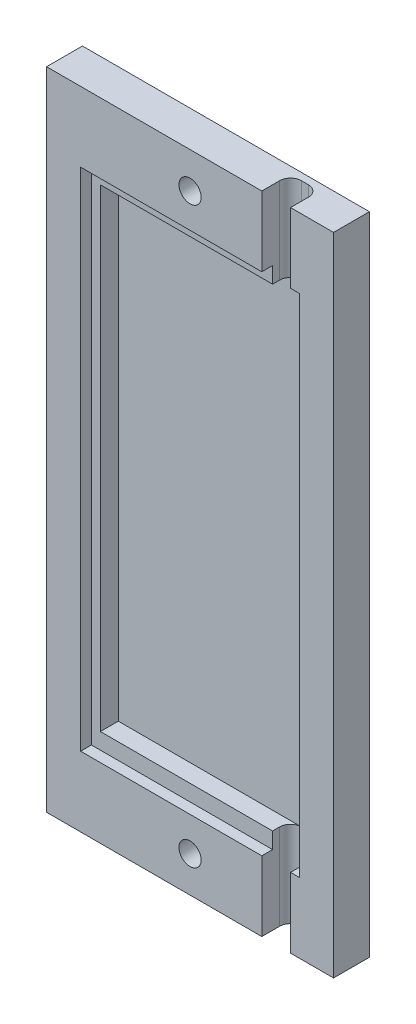
ISO-10303-21;
HEADER;
FILE_DESCRIPTION(('STEP AP214'),'2;1');
FILE_NAME('part.step','',(''),(''),'','','');
FILE_SCHEMA(('AUTOMOTIVE_DESIGN { 1 0 10303 214 1 1 1 1 }'));
ENDSEC;
DATA;
#1=APPLICATION_CONTEXT('core data for automotive mechanical design processes');
#2=APPLICATION_PROTOCOL_DEFINITION('international standard','automotive_design',2000,#1);
#3=PRODUCT_CONTEXT('',#1,'mechanical');
#4=PRODUCT('Part','Part','',(#3));
#5=PRODUCT_RELATED_PRODUCT_CATEGORY('part','',(#4));
#6=PRODUCT_DEFINITION_FORMATION('','',#4);
#7=PRODUCT_DEFINITION_CONTEXT('part definition',#1,'design');
#8=PRODUCT_DEFINITION('design','',#6,#7);
#9=PRODUCT_DEFINITION_SHAPE('','',#8);
#10=(LENGTH_UNIT() NAMED_UNIT(*) SI_UNIT(.MILLI.,.METRE.));
#11=(NAMED_UNIT(*) PLANE_ANGLE_UNIT() SI_UNIT($,.RADIAN.));
#12=(NAMED_UNIT(*) SI_UNIT($,.STERADIAN.) SOLID_ANGLE_UNIT());
#13=UNCERTAINTY_MEASURE_WITH_UNIT(LENGTH_MEASURE(1.E-05),#10,'distance_accuracy_value','');
#14=(GEOMETRIC_REPRESENTATION_CONTEXT(3) GLOBAL_UNCERTAINTY_ASSIGNED_CONTEXT((#13)) GLOBAL_UNIT_ASSIGNED_CONTEXT((#10,
#11,#12)) REPRESENTATION_CONTEXT('',''));
#15=CARTESIAN_POINT('',(0.,0.,0.));
#16=DIRECTION('',(0.,0.,1.));
#17=DIRECTION('',(1.,0.,0.));
#18=AXIS2_PLACEMENT_3D('',#15,#16,#17);
#19=CARTESIAN_POINT('',(0.,0.,3.5));
#20=DIRECTION('',(0.,0.,-1.));
#21=DIRECTION('',(-1.,0.,0.));
#22=AXIS2_PLACEMENT_3D('',#19,#20,#21);
#23=PLANE('',#22);
#24=DIRECTION('',(-1.,0.,0.));
#25=VECTOR('',#24,1.);
#26=CARTESIAN_POINT('',(-35.25,80.25,3.5));
#27=LINE('',#26,#25);
#28=CARTESIAN_POINT('',(-4.75,80.25,3.5));
#29=VERTEX_POINT('',#28);
#30=CARTESIAN_POINT('',(-6.,80.25,3.5));
#31=VERTEX_POINT('',#30);
#32=EDGE_CURVE('E329',#29,#31,#27,.T.);
#33=ORIENTED_EDGE('',*,*,#32,.T.);
#34=DIRECTION('',(0.,1.,0.));
#35=VECTOR('',#34,1.);
#36=CARTESIAN_POINT('',(-6.,78.,3.5));
#37=LINE('',#36,#35);
#38=CARTESIAN_POINT('',(-6.,9.74999999999999,3.5));
#39=VERTEX_POINT('',#38);
#40=EDGE_CURVE('E313',#39,#31,#37,.T.);
#41=ORIENTED_EDGE('',*,*,#40,.F.);
#42=DIRECTION('',(1.,0.,0.));
#43=VECTOR('',#42,1.);
#44=CARTESIAN_POINT('',(-35.25,9.75,3.5));
#45=LINE('',#44,#43);
#46=CARTESIAN_POINT('',(-4.75,9.74999999999999,3.5));
#47=VERTEX_POINT('',#46);
#48=EDGE_CURVE('E339',#39,#47,#45,.T.);
#49=ORIENTED_EDGE('',*,*,#48,.T.);
#50=DIRECTION('',(0.,1.,0.));
#51=VECTOR('',#50,1.);
#52=CARTESIAN_POINT('',(-4.75,80.25,3.5));
#53=LINE('',#52,#51);
#54=EDGE_CURVE('E343',#47,#29,#53,.T.);
#55=ORIENTED_EDGE('',*,*,#54,.T.);
#56=EDGE_LOOP('',(#33,#41,#49,#55));
#57=FACE_BOUND('',#56,.T.);
#58=ADVANCED_FACE('F36',(#57),#23,.F.);
#59=CARTESIAN_POINT('',(0.,0.,5.));
#60=DIRECTION('',(0.,1.,0.));
#61=DIRECTION('',(0.,0.,1.));
#62=AXIS2_PLACEMENT_3D('',#59,#60,#61);
#63=PLANE('',#62);
#64=DIRECTION('',(0.,0.,1.));
#65=VECTOR('',#64,1.);
#66=CARTESIAN_POINT('',(-6.,0.,5.));
#67=LINE('',#66,#65);
#68=CARTESIAN_POINT('',(-6.,0.,2.5));
#69=VERTEX_POINT('',#68);
#70=CARTESIAN_POINT('',(-6.,0.,5.));
#71=VERTEX_POINT('',#70);
#72=EDGE_CURVE('E400',#69,#71,#67,.T.);
#73=ORIENTED_EDGE('',*,*,#72,.F.);
#74=CARTESIAN_POINT('',(-7.5,0.,2.5));
#75=DIRECTION('',(0.,1.,0.));
#76=DIRECTION('',(0.,0.,1.));
#77=AXIS2_PLACEMENT_3D('',#74,#75,#76);
#78=CIRCLE('',#77,1.5);
#79=CARTESIAN_POINT('',(-7.5,0.,1.));
#80=VERTEX_POINT('',#79);
#81=EDGE_CURVE('E11',#69,#80,#78,.T.);
#82=ORIENTED_EDGE('',*,*,#81,.T.);
#83=DIRECTION('',(1.,0.,0.));
#84=VECTOR('',#83,1.);
#85=CARTESIAN_POINT('',(-6.,0.,1.));
#86=LINE('',#85,#84);
#87=CARTESIAN_POINT('',(-8.5,0.,1.));
#88=VERTEX_POINT('',#87);
#89=EDGE_CURVE('E197',#88,#80,#86,.T.);
#90=ORIENTED_EDGE('',*,*,#89,.F.);
#91=CARTESIAN_POINT('',(-8.5,0.,2.5));
#92=DIRECTION('',(0.,1.,0.));
#93=DIRECTION('',(0.,0.,1.));
#94=AXIS2_PLACEMENT_3D('',#91,#92,#93);
#95=CIRCLE('',#94,1.5);
#96=CARTESIAN_POINT('',(-10.,0.,2.5));
#97=VERTEX_POINT('',#96);
#98=EDGE_CURVE('E263',#88,#97,#95,.T.);
#99=ORIENTED_EDGE('',*,*,#98,.T.);
#100=DIRECTION('',(0.,0.,-1.));
#101=VECTOR('',#100,1.);
#102=CARTESIAN_POINT('',(-10.,0.,5.));
#103=LINE('',#102,#101);
#104=CARTESIAN_POINT('',(-10.,0.,5.));
#105=VERTEX_POINT('',#104);
#106=EDGE_CURVE('E398',#105,#97,#103,.T.);
#107=ORIENTED_EDGE('',*,*,#106,.F.);
#108=DIRECTION('',(1.,0.,0.));
#109=VECTOR('',#108,1.);
#110=CARTESIAN_POINT('',(0.,0.,5.));
#111=LINE('',#110,#109);
#112=CARTESIAN_POINT('',(-40.,0.,5.));
#113=VERTEX_POINT('',#112);
#114=EDGE_CURVE('E365',#113,#105,#111,.T.);
#115=ORIENTED_EDGE('',*,*,#114,.F.);
#116=DIRECTION('',(0.,0.,-1.));
#117=VECTOR('',#116,1.);
#118=CARTESIAN_POINT('',(-40.,0.,5.));
#119=LINE('',#118,#117);
#120=CARTESIAN_POINT('',(-40.,0.,0.));
#121=VERTEX_POINT('',#120);
#122=EDGE_CURVE('E220',#113,#121,#119,.T.);
#123=ORIENTED_EDGE('',*,*,#122,.T.);
#124=DIRECTION('',(1.,0.,0.));
#125=VECTOR('',#124,1.);
#126=CARTESIAN_POINT('',(0.,0.,0.));
#127=LINE('',#126,#125);
#128=CARTESIAN_POINT('',(0.,0.,0.));
#129=VERTEX_POINT('',#128);
#130=EDGE_CURVE('E225',#121,#129,#127,.T.);
#131=ORIENTED_EDGE('',*,*,#130,.T.);
#132=DIRECTION('',(0.,0.,-1.));
#133=VECTOR('',#132,1.);
#134=CARTESIAN_POINT('',(0.,0.,5.));
#135=LINE('',#134,#133);
#136=CARTESIAN_POINT('',(0.,0.,5.));
#137=VERTEX_POINT('',#136);
#138=EDGE_CURVE('E238',#137,#129,#135,.T.);
#139=ORIENTED_EDGE('',*,*,#138,.F.);
#140=EDGE_CURVE('E234',#71,#137,#111,.T.);
#141=ORIENTED_EDGE('',*,*,#140,.F.);
#142=EDGE_LOOP('',(#73,#82,#90,#99,#107,#115,#123,#131,#139,#141));
#143=FACE_BOUND('',#142,.T.);
#144=ADVANCED_FACE('F376',(#143),#63,.F.);
#145=CARTESIAN_POINT('',(0.,0.,5.));
#146=DIRECTION('',(0.,0.,-1.));
#147=DIRECTION('',(-1.,0.,0.));
#148=AXIS2_PLACEMENT_3D('',#145,#146,#147);
#149=PLANE('',#148);
#150=CARTESIAN_POINT('',(-20.,5.,5.));
#151=DIRECTION('',(0.,0.,1.));
#152=DIRECTION('',(1.,0.,0.));
#153=AXIS2_PLACEMENT_3D('',#150,#151,#152);
#154=CIRCLE('',#153,1.55);
#155=CARTESIAN_POINT('',(-18.45,5.,5.));
#156=VERTEX_POINT('',#155);
#157=EDGE_CURVE('E406',#156,#156,#154,.T.);
#158=ORIENTED_EDGE('',*,*,#157,.F.);
#159=EDGE_LOOP('',(#158));
#160=FACE_BOUND('',#159,.T.);
#161=CARTESIAN_POINT('',(-20.,85.,5.));
#162=DIRECTION('',(0.,0.,1.));
#163=DIRECTION('',(1.,0.,0.));
#164=AXIS2_PLACEMENT_3D('',#161,#162,#163);
#165=CIRCLE('',#164,1.55);
#166=CARTESIAN_POINT('',(-18.45,85.,5.));
#167=VERTEX_POINT('',#166);
#168=EDGE_CURVE('E401',#167,#167,#165,.T.);
#169=ORIENTED_EDGE('',*,*,#168,.F.);
#170=EDGE_LOOP('',(#169));
#171=FACE_BOUND('',#170,.T.);
#172=DIRECTION('',(0.,-1.,0.));
#173=VECTOR('',#172,1.);
#174=CARTESIAN_POINT('',(-10.,90.,5.));
#175=LINE('',#174,#173);
#176=CARTESIAN_POINT('',(-10.,90.,5.));
#177=VERTEX_POINT('',#176);
#178=CARTESIAN_POINT('',(-10.,80.25,5.));
#179=VERTEX_POINT('',#178);
#180=EDGE_CURVE('E388',#177,#179,#175,.T.);
#181=ORIENTED_EDGE('',*,*,#180,.F.);
#182=DIRECTION('',(-1.,0.,0.));
#183=VECTOR('',#182,1.);
#184=CARTESIAN_POINT('',(0.,90.,5.));
#185=LINE('',#184,#183);
#186=CARTESIAN_POINT('',(-40.,90.,5.));
#187=VERTEX_POINT('',#186);
#188=EDGE_CURVE('E214',#177,#187,#185,.T.);
#189=ORIENTED_EDGE('',*,*,#188,.T.);
#190=DIRECTION('',(0.,-1.,0.));
#191=VECTOR('',#190,1.);
#192=CARTESIAN_POINT('',(-40.,0.,5.));
#193=LINE('',#192,#191);
#194=EDGE_CURVE('E212',#187,#113,#193,.T.);
#195=ORIENTED_EDGE('',*,*,#194,.T.);
#196=ORIENTED_EDGE('',*,*,#114,.T.);
#197=CARTESIAN_POINT('',(-10.,9.75000000000002,5.));
#198=VERTEX_POINT('',#197);
#199=EDGE_CURVE('E210',#198,#105,#175,.T.);
#200=ORIENTED_EDGE('',*,*,#199,.F.);
#201=DIRECTION('',(1.,0.,0.));
#202=VECTOR('',#201,1.);
#203=CARTESIAN_POINT('',(-35.25,9.75,5.));
#204=LINE('',#203,#202);
#205=CARTESIAN_POINT('',(-35.25,9.75,5.));
#206=VERTEX_POINT('',#205);
#207=EDGE_CURVE('E352',#206,#198,#204,.T.);
#208=ORIENTED_EDGE('',*,*,#207,.F.);
#209=DIRECTION('',(0.,-1.,0.));
#210=VECTOR('',#209,1.);
#211=CARTESIAN_POINT('',(-35.25,80.25,5.));
#212=LINE('',#211,#210);
#213=CARTESIAN_POINT('',(-35.25,80.25,5.));
#214=VERTEX_POINT('',#213);
#215=EDGE_CURVE('E350',#214,#206,#212,.T.);
#216=ORIENTED_EDGE('',*,*,#215,.F.);
#217=DIRECTION('',(-1.,0.,0.));
#218=VECTOR('',#217,1.);
#219=CARTESIAN_POINT('',(-35.25,80.25,5.));
#220=LINE('',#219,#218);
#221=EDGE_CURVE('E330',#179,#214,#220,.T.);
#222=ORIENTED_EDGE('',*,*,#221,.F.);
#223=EDGE_LOOP('',(#181,#189,#195,#196,#200,#208,#216,#222));
#224=FACE_BOUND('',#223,.T.);
#225=ADVANCED_FACE('F389',(#160,#171,#224),#149,.F.);
#226=CARTESIAN_POINT('',(-35.25,80.25,3.5));
#227=DIRECTION('',(0.,1.,0.));
#228=DIRECTION('',(-1.,0.,0.));
#229=AXIS2_PLACEMENT_3D('',#226,#227,#228);
#230=PLANE('',#229);
#231=CARTESIAN_POINT('',(-4.75,80.25,5.));
#232=VERTEX_POINT('',#231);
#233=CARTESIAN_POINT('',(-6.,80.25,5.));
#234=VERTEX_POINT('',#233);
#235=EDGE_CURVE('E341',#232,#234,#220,.T.);
#236=ORIENTED_EDGE('',*,*,#235,.T.);
#237=DIRECTION('',(0.,0.,-1.));
#238=VECTOR('',#237,1.);
#239=CARTESIAN_POINT('',(-6.,80.25,3.5));
#240=LINE('',#239,#238);
#241=EDGE_CURVE('E201',#234,#31,#240,.T.);
#242=ORIENTED_EDGE('',*,*,#241,.T.);
#243=ORIENTED_EDGE('',*,*,#32,.F.);
#244=DIRECTION('',(0.,0.,1.));
#245=VECTOR('',#244,1.);
#246=CARTESIAN_POINT('',(-4.75,80.25,3.5));
#247=LINE('',#246,#245);
#248=EDGE_CURVE('E227',#29,#232,#247,.T.);
#249=ORIENTED_EDGE('',*,*,#248,.T.);
#250=EDGE_LOOP('',(#236,#242,#243,#249));
#251=FACE_BOUND('',#250,.T.);
#252=ADVANCED_FACE('F426',(#251),#230,.F.);
#253=CARTESIAN_POINT('',(-35.25,9.75,3.5));
#254=DIRECTION('',(0.,-1.,0.));
#255=DIRECTION('',(1.,0.,0.));
#256=AXIS2_PLACEMENT_3D('',#253,#254,#255);
#257=PLANE('',#256);
#258=ORIENTED_EDGE('',*,*,#48,.F.);
#259=DIRECTION('',(0.,0.,1.));
#260=VECTOR('',#259,1.);
#261=CARTESIAN_POINT('',(-6.,9.74999999999999,3.5));
#262=LINE('',#261,#260);
#263=CARTESIAN_POINT('',(-6.,9.75000000000002,5.));
#264=VERTEX_POINT('',#263);
#265=EDGE_CURVE('E248',#39,#264,#262,.T.);
#266=ORIENTED_EDGE('',*,*,#265,.T.);
#267=CARTESIAN_POINT('',(-4.75,9.74999999999999,5.));
#268=VERTEX_POINT('',#267);
#269=EDGE_CURVE('E348',#264,#268,#204,.T.);
#270=ORIENTED_EDGE('',*,*,#269,.T.);
#271=DIRECTION('',(0.,0.,1.));
#272=VECTOR('',#271,1.);
#273=CARTESIAN_POINT('',(-4.75,9.74999999999999,3.5));
#274=LINE('',#273,#272);
#275=EDGE_CURVE('E357',#47,#268,#274,.T.);
#276=ORIENTED_EDGE('',*,*,#275,.F.);
#277=EDGE_LOOP('',(#258,#266,#270,#276));
#278=FACE_BOUND('',#277,.T.);
#279=ADVANCED_FACE('F457',(#278),#257,.F.);
#280=CARTESIAN_POINT('',(-35.25,9.75,3.5));
#281=VERTEX_POINT('',#280);
#282=CARTESIAN_POINT('',(-10.,9.74999999999999,3.5));
#283=VERTEX_POINT('',#282);
#284=EDGE_CURVE('E340',#281,#283,#45,.T.);
#285=ORIENTED_EDGE('',*,*,#284,.T.);
#286=DIRECTION('',(0.,1.,0.));
#287=VECTOR('',#286,1.);
#288=CARTESIAN_POINT('',(-10.,0.,3.5));
#289=LINE('',#288,#287);
#290=CARTESIAN_POINT('',(-10.,12.,3.5));
#291=VERTEX_POINT('',#290);
#292=EDGE_CURVE('E303',#283,#291,#289,.T.);
#293=ORIENTED_EDGE('',*,*,#292,.T.);
#294=DIRECTION('',(1.,0.,0.));
#295=VECTOR('',#294,1.);
#296=CARTESIAN_POINT('',(-34.,12.,3.5));
#297=LINE('',#296,#295);
#298=CARTESIAN_POINT('',(-34.,12.,3.5));
#299=VERTEX_POINT('',#298);
#300=EDGE_CURVE('E321',#299,#291,#297,.T.);
#301=ORIENTED_EDGE('',*,*,#300,.F.);
#302=DIRECTION('',(0.,-1.,0.));
#303=VECTOR('',#302,1.);
#304=CARTESIAN_POINT('',(-34.,78.,3.5));
#305=LINE('',#304,#303);
#306=CARTESIAN_POINT('',(-34.,78.,3.5));
#307=VERTEX_POINT('',#306);
#308=EDGE_CURVE('E318',#307,#299,#305,.T.);
#309=ORIENTED_EDGE('',*,*,#308,.F.);
#310=DIRECTION('',(-1.,0.,0.));
#311=VECTOR('',#310,1.);
#312=CARTESIAN_POINT('',(-34.,78.,3.5));
#313=LINE('',#312,#311);
#314=CARTESIAN_POINT('',(-10.,78.,3.5));
#315=VERTEX_POINT('',#314);
#316=EDGE_CURVE('E306',#315,#307,#313,.T.);
#317=ORIENTED_EDGE('',*,*,#316,.F.);
#318=CARTESIAN_POINT('',(-10.,80.25,3.5));
#319=VERTEX_POINT('',#318);
#320=EDGE_CURVE('E293',#315,#319,#289,.T.);
#321=ORIENTED_EDGE('',*,*,#320,.T.);
#322=CARTESIAN_POINT('',(-35.25,80.25,3.5));
#323=VERTEX_POINT('',#322);
#324=EDGE_CURVE('E331',#319,#323,#27,.T.);
#325=ORIENTED_EDGE('',*,*,#324,.T.);
#326=DIRECTION('',(0.,-1.,0.));
#327=VECTOR('',#326,1.);
#328=CARTESIAN_POINT('',(-35.25,80.25,3.5));
#329=LINE('',#328,#327);
#330=EDGE_CURVE('E334',#323,#281,#329,.T.);
#331=ORIENTED_EDGE('',*,*,#330,.T.);
#332=EDGE_LOOP('',(#285,#293,#301,#309,#317,#321,#325,#331));
#333=FACE_BOUND('',#332,.T.);
#334=ADVANCED_FACE('F447',(#333),#23,.F.);
#335=CARTESIAN_POINT('',(0.,0.,5.));
#336=DIRECTION('',(-1.,0.,0.));
#337=DIRECTION('',(0.,0.,1.));
#338=AXIS2_PLACEMENT_3D('',#335,#336,#337);
#339=PLANE('',#338);
#340=DIRECTION('',(0.,1.,0.));
#341=VECTOR('',#340,1.);
#342=CARTESIAN_POINT('',(0.,0.,0.));
#343=LINE('',#342,#341);
#344=CARTESIAN_POINT('',(0.,90.,0.));
#345=VERTEX_POINT('',#344);
#346=EDGE_CURVE('E223',#129,#345,#343,.T.);
#347=ORIENTED_EDGE('',*,*,#346,.T.);
#348=DIRECTION('',(0.,0.,-1.));
#349=VECTOR('',#348,1.);
#350=CARTESIAN_POINT('',(0.,90.,5.));
#351=LINE('',#350,#349);
#352=CARTESIAN_POINT('',(0.,90.,5.));
#353=VERTEX_POINT('',#352);
#354=EDGE_CURVE('E236',#353,#345,#351,.T.);
#355=ORIENTED_EDGE('',*,*,#354,.F.);
#356=DIRECTION('',(0.,1.,0.));
#357=VECTOR('',#356,1.);
#358=CARTESIAN_POINT('',(0.,0.,5.));
#359=LINE('',#358,#357);
#360=EDGE_CURVE('E215',#137,#353,#359,.T.);
#361=ORIENTED_EDGE('',*,*,#360,.F.);
#362=ORIENTED_EDGE('',*,*,#138,.T.);
#363=EDGE_LOOP('',(#347,#355,#361,#362));
#364=FACE_BOUND('',#363,.T.);
#365=ADVANCED_FACE('F374',(#364),#339,.F.);
#366=CARTESIAN_POINT('',(0.,90.,5.));
#367=DIRECTION('',(0.,-1.,0.));
#368=DIRECTION('',(0.,0.,-1.));
#369=AXIS2_PLACEMENT_3D('',#366,#367,#368);
#370=PLANE('',#369);
#371=DIRECTION('',(0.,0.,-1.));
#372=VECTOR('',#371,1.);
#373=CARTESIAN_POINT('',(-10.,90.,5.));
#374=LINE('',#373,#372);
#375=CARTESIAN_POINT('',(-10.,90.,2.5));
#376=VERTEX_POINT('',#375);
#377=EDGE_CURVE('E198',#177,#376,#374,.T.);
#378=ORIENTED_EDGE('',*,*,#377,.T.);
#379=CARTESIAN_POINT('',(-8.5,90.,2.5));
#380=DIRECTION('',(0.,-1.,0.));
#381=DIRECTION('',(0.,0.,-1.));
#382=AXIS2_PLACEMENT_3D('',#379,#380,#381);
#383=CIRCLE('',#382,1.5);
#384=CARTESIAN_POINT('',(-8.5,90.,1.));
#385=VERTEX_POINT('',#384);
#386=EDGE_CURVE('E269',#376,#385,#383,.T.);
#387=ORIENTED_EDGE('',*,*,#386,.T.);
#388=DIRECTION('',(1.,0.,0.));
#389=VECTOR('',#388,1.);
#390=CARTESIAN_POINT('',(-6.,90.,1.));
#391=LINE('',#390,#389);
#392=CARTESIAN_POINT('',(-7.5,90.,1.));
#393=VERTEX_POINT('',#392);
#394=EDGE_CURVE('E272',#385,#393,#391,.T.);
#395=ORIENTED_EDGE('',*,*,#394,.T.);
#396=CARTESIAN_POINT('',(-7.5,90.,2.5));
#397=DIRECTION('',(0.,-1.,0.));
#398=DIRECTION('',(0.,0.,-1.));
#399=AXIS2_PLACEMENT_3D('',#396,#397,#398);
#400=CIRCLE('',#399,1.5);
#401=CARTESIAN_POINT('',(-6.,90.,2.5));
#402=VERTEX_POINT('',#401);
#403=EDGE_CURVE('E46',#393,#402,#400,.T.);
#404=ORIENTED_EDGE('',*,*,#403,.T.);
#405=DIRECTION('',(0.,0.,1.));
#406=VECTOR('',#405,1.);
#407=CARTESIAN_POINT('',(-6.,90.,5.));
#408=LINE('',#407,#406);
#409=CARTESIAN_POINT('',(-6.,90.,5.));
#410=VERTEX_POINT('',#409);
#411=EDGE_CURVE('E186',#402,#410,#408,.T.);
#412=ORIENTED_EDGE('',*,*,#411,.T.);
#413=EDGE_CURVE('E191',#353,#410,#185,.T.);
#414=ORIENTED_EDGE('',*,*,#413,.F.);
#415=ORIENTED_EDGE('',*,*,#354,.T.);
#416=DIRECTION('',(-1.,0.,0.));
#417=VECTOR('',#416,1.);
#418=CARTESIAN_POINT('',(0.,90.,0.));
#419=LINE('',#418,#417);
#420=CARTESIAN_POINT('',(-40.,90.,0.));
#421=VERTEX_POINT('',#420);
#422=EDGE_CURVE('E230',#345,#421,#419,.T.);
#423=ORIENTED_EDGE('',*,*,#422,.T.);
#424=DIRECTION('',(0.,0.,-1.));
#425=VECTOR('',#424,1.);
#426=CARTESIAN_POINT('',(-40.,90.,5.));
#427=LINE('',#426,#425);
#428=EDGE_CURVE('E231',#187,#421,#427,.T.);
#429=ORIENTED_EDGE('',*,*,#428,.F.);
#430=ORIENTED_EDGE('',*,*,#188,.F.);
#431=EDGE_LOOP('',(#378,#387,#395,#404,#412,#414,#415,#423,#429,#430));
#432=FACE_BOUND('',#431,.T.);
#433=ADVANCED_FACE('F194',(#432),#370,.F.);
#434=CARTESIAN_POINT('',(-40.,0.,5.));
#435=DIRECTION('',(1.,0.,0.));
#436=DIRECTION('',(0.,0.,-1.));
#437=AXIS2_PLACEMENT_3D('',#434,#435,#436);
#438=PLANE('',#437);
#439=DIRECTION('',(0.,-1.,0.));
#440=VECTOR('',#439,1.);
#441=CARTESIAN_POINT('',(-40.,0.,0.));
#442=LINE('',#441,#440);
#443=EDGE_CURVE('E228',#421,#121,#442,.T.);
#444=ORIENTED_EDGE('',*,*,#443,.T.);
#445=ORIENTED_EDGE('',*,*,#122,.F.);
#446=ORIENTED_EDGE('',*,*,#194,.F.);
#447=ORIENTED_EDGE('',*,*,#428,.T.);
#448=EDGE_LOOP('',(#444,#445,#446,#447));
#449=FACE_BOUND('',#448,.T.);
#450=ADVANCED_FACE('F387',(#449),#438,.F.);
#451=ORIENTED_EDGE('',*,*,#413,.T.);
#452=DIRECTION('',(0.,-1.,0.));
#453=VECTOR('',#452,1.);
#454=CARTESIAN_POINT('',(-6.,90.,5.));
#455=LINE('',#454,#453);
#456=EDGE_CURVE('E199',#410,#234,#455,.T.);
#457=ORIENTED_EDGE('',*,*,#456,.T.);
#458=ORIENTED_EDGE('',*,*,#235,.F.);
#459=DIRECTION('',(0.,1.,0.));
#460=VECTOR('',#459,1.);
#461=CARTESIAN_POINT('',(-4.75,80.25,5.));
#462=LINE('',#461,#460);
#463=EDGE_CURVE('E351',#268,#232,#462,.T.);
#464=ORIENTED_EDGE('',*,*,#463,.F.);
#465=ORIENTED_EDGE('',*,*,#269,.F.);
#466=EDGE_CURVE('E208',#264,#71,#455,.T.);
#467=ORIENTED_EDGE('',*,*,#466,.T.);
#468=ORIENTED_EDGE('',*,*,#140,.T.);
#469=ORIENTED_EDGE('',*,*,#360,.T.);
#470=EDGE_LOOP('',(#451,#457,#458,#464,#465,#467,#468,#469));
#471=FACE_BOUND('',#470,.T.);
#472=ADVANCED_FACE('F209',(#471),#149,.F.);
#473=CARTESIAN_POINT('',(0.,0.,0.));
#474=DIRECTION('',(0.,0.,-1.));
#475=DIRECTION('',(-1.,0.,0.));
#476=AXIS2_PLACEMENT_3D('',#473,#474,#475);
#477=PLANE('',#476);
#478=ORIENTED_EDGE('',*,*,#130,.F.);
#479=ORIENTED_EDGE('',*,*,#443,.F.);
#480=ORIENTED_EDGE('',*,*,#422,.F.);
#481=ORIENTED_EDGE('',*,*,#346,.F.);
#482=EDGE_LOOP('',(#478,#479,#480,#481));
#483=FACE_BOUND('',#482,.T.);
#484=ADVANCED_FACE('F381',(#483),#477,.T.);
#485=ORIENTED_EDGE('',*,*,#324,.F.);
#486=DIRECTION('',(0.,0.,1.));
#487=VECTOR('',#486,1.);
#488=CARTESIAN_POINT('',(-10.,80.25,3.5));
#489=LINE('',#488,#487);
#490=EDGE_CURVE('E296',#319,#179,#489,.T.);
#491=ORIENTED_EDGE('',*,*,#490,.T.);
#492=ORIENTED_EDGE('',*,*,#221,.T.);
#493=DIRECTION('',(0.,0.,1.));
#494=VECTOR('',#493,1.);
#495=CARTESIAN_POINT('',(-35.25,80.25,3.5));
#496=LINE('',#495,#494);
#497=EDGE_CURVE('E345',#323,#214,#496,.T.);
#498=ORIENTED_EDGE('',*,*,#497,.F.);
#499=EDGE_LOOP('',(#485,#491,#492,#498));
#500=FACE_BOUND('',#499,.T.);
#501=ADVANCED_FACE('F477',(#500),#230,.F.);
#502=CARTESIAN_POINT('',(-4.75,80.25,3.5));
#503=DIRECTION('',(1.,0.,0.));
#504=DIRECTION('',(0.,1.,0.));
#505=AXIS2_PLACEMENT_3D('',#502,#503,#504);
#506=PLANE('',#505);
#507=ORIENTED_EDGE('',*,*,#463,.T.);
#508=ORIENTED_EDGE('',*,*,#248,.F.);
#509=ORIENTED_EDGE('',*,*,#54,.F.);
#510=ORIENTED_EDGE('',*,*,#275,.T.);
#511=EDGE_LOOP('',(#507,#508,#509,#510));
#512=FACE_BOUND('',#511,.T.);
#513=ADVANCED_FACE('F498',(#512),#506,.F.);
#514=ORIENTED_EDGE('',*,*,#207,.T.);
#515=DIRECTION('',(0.,0.,-1.));
#516=VECTOR('',#515,1.);
#517=CARTESIAN_POINT('',(-10.,9.74999999999999,3.5));
#518=LINE('',#517,#516);
#519=EDGE_CURVE('E299',#198,#283,#518,.T.);
#520=ORIENTED_EDGE('',*,*,#519,.T.);
#521=ORIENTED_EDGE('',*,*,#284,.F.);
#522=DIRECTION('',(0.,0.,1.));
#523=VECTOR('',#522,1.);
#524=CARTESIAN_POINT('',(-35.25,9.75,3.5));
#525=LINE('',#524,#523);
#526=EDGE_CURVE('E363',#281,#206,#525,.T.);
#527=ORIENTED_EDGE('',*,*,#526,.T.);
#528=EDGE_LOOP('',(#514,#520,#521,#527));
#529=FACE_BOUND('',#528,.T.);
#530=ADVANCED_FACE('F468',(#529),#257,.F.);
#531=CARTESIAN_POINT('',(-35.25,80.25,3.5));
#532=DIRECTION('',(-1.,0.,0.));
#533=DIRECTION('',(0.,0.,1.));
#534=AXIS2_PLACEMENT_3D('',#531,#532,#533);
#535=PLANE('',#534);
#536=ORIENTED_EDGE('',*,*,#215,.T.);
#537=ORIENTED_EDGE('',*,*,#526,.F.);
#538=ORIENTED_EDGE('',*,*,#330,.F.);
#539=ORIENTED_EDGE('',*,*,#497,.T.);
#540=EDGE_LOOP('',(#536,#537,#538,#539));
#541=FACE_BOUND('',#540,.T.);
#542=ADVANCED_FACE('F478',(#541),#535,.F.);
#543=CARTESIAN_POINT('',(-34.,78.,1.));
#544=DIRECTION('',(0.,1.,0.));
#545=DIRECTION('',(-1.,0.,0.));
#546=AXIS2_PLACEMENT_3D('',#543,#544,#545);
#547=PLANE('',#546);
#548=DIRECTION('',(-1.,0.,0.));
#549=VECTOR('',#548,1.);
#550=CARTESIAN_POINT('',(-34.,78.,1.));
#551=LINE('',#550,#549);
#552=CARTESIAN_POINT('',(-8.50000000000001,78.,1.));
#553=VERTEX_POINT('',#552);
#554=CARTESIAN_POINT('',(-34.,78.,1.));
#555=VERTEX_POINT('',#554);
#556=EDGE_CURVE('E292',#553,#555,#551,.T.);
#557=ORIENTED_EDGE('',*,*,#556,.F.);
#558=CARTESIAN_POINT('',(-8.5,78.,2.5));
#559=DIRECTION('',(0.,1.,0.));
#560=DIRECTION('',(-1.,0.,0.));
#561=AXIS2_PLACEMENT_3D('',#558,#559,#560);
#562=CIRCLE('',#561,1.5);
#563=CARTESIAN_POINT('',(-10.,78.,2.5));
#564=VERTEX_POINT('',#563);
#565=EDGE_CURVE('E268',#553,#564,#562,.T.);
#566=ORIENTED_EDGE('',*,*,#565,.T.);
#567=DIRECTION('',(0.,0.,1.));
#568=VECTOR('',#567,1.);
#569=CARTESIAN_POINT('',(-10.,78.,1.));
#570=LINE('',#569,#568);
#571=EDGE_CURVE('E287',#564,#315,#570,.T.);
#572=ORIENTED_EDGE('',*,*,#571,.T.);
#573=ORIENTED_EDGE('',*,*,#316,.T.);
#574=DIRECTION('',(0.,0.,1.));
#575=VECTOR('',#574,1.);
#576=CARTESIAN_POINT('',(-34.,78.,1.));
#577=LINE('',#576,#575);
#578=EDGE_CURVE('E316',#555,#307,#577,.T.);
#579=ORIENTED_EDGE('',*,*,#578,.F.);
#580=EDGE_LOOP('',(#557,#566,#572,#573,#579));
#581=FACE_BOUND('',#580,.T.);
#582=ADVANCED_FACE('F289',(#581),#547,.F.);
#583=CARTESIAN_POINT('',(-6.,78.,1.));
#584=DIRECTION('',(1.,0.,0.));
#585=DIRECTION('',(0.,1.,0.));
#586=AXIS2_PLACEMENT_3D('',#583,#584,#585);
#587=PLANE('',#586);
#588=ORIENTED_EDGE('',*,*,#411,.F.);
#589=DIRECTION('',(0.,1.,0.));
#590=VECTOR('',#589,1.);
#591=CARTESIAN_POINT('',(-6.,0.,2.5));
#592=LINE('',#591,#590);
#593=EDGE_CURVE('E52',#402,#69,#592,.F.);
#594=ORIENTED_EDGE('',*,*,#593,.T.);
#595=ORIENTED_EDGE('',*,*,#72,.T.);
#596=ORIENTED_EDGE('',*,*,#466,.F.);
#597=ORIENTED_EDGE('',*,*,#265,.F.);
#598=ORIENTED_EDGE('',*,*,#40,.T.);
#599=ORIENTED_EDGE('',*,*,#241,.F.);
#600=ORIENTED_EDGE('',*,*,#456,.F.);
#601=EDGE_LOOP('',(#588,#594,#595,#596,#597,#598,#599,#600));
#602=FACE_BOUND('',#601,.T.);
#603=ADVANCED_FACE('F203',(#602),#587,.F.);
#604=CARTESIAN_POINT('',(-34.,12.,1.));
#605=DIRECTION('',(0.,-1.,0.));
#606=DIRECTION('',(1.,0.,0.));
#607=AXIS2_PLACEMENT_3D('',#604,#605,#606);
#608=PLANE('',#607);
#609=ORIENTED_EDGE('',*,*,#300,.T.);
#610=DIRECTION('',(0.,0.,-1.));
#611=VECTOR('',#610,1.);
#612=CARTESIAN_POINT('',(-10.,12.,1.));
#613=LINE('',#612,#611);
#614=CARTESIAN_POINT('',(-10.,12.,2.5));
#615=VERTEX_POINT('',#614);
#616=EDGE_CURVE('E245',#291,#615,#613,.T.);
#617=ORIENTED_EDGE('',*,*,#616,.T.);
#618=CARTESIAN_POINT('',(-8.5,12.,2.5));
#619=DIRECTION('',(0.,-1.,0.));
#620=DIRECTION('',(1.,0.,0.));
#621=AXIS2_PLACEMENT_3D('',#618,#619,#620);
#622=CIRCLE('',#621,1.5);
#623=CARTESIAN_POINT('',(-8.5,12.,1.));
#624=VERTEX_POINT('',#623);
#625=EDGE_CURVE('E264',#615,#624,#622,.T.);
#626=ORIENTED_EDGE('',*,*,#625,.T.);
#627=DIRECTION('',(1.,0.,0.));
#628=VECTOR('',#627,1.);
#629=CARTESIAN_POINT('',(-34.,12.,1.));
#630=LINE('',#629,#628);
#631=CARTESIAN_POINT('',(-34.,12.,1.));
#632=VERTEX_POINT('',#631);
#633=EDGE_CURVE('E314',#632,#624,#630,.T.);
#634=ORIENTED_EDGE('',*,*,#633,.F.);
#635=DIRECTION('',(0.,0.,1.));
#636=VECTOR('',#635,1.);
#637=CARTESIAN_POINT('',(-34.,12.,1.));
#638=LINE('',#637,#636);
#639=EDGE_CURVE('E324',#632,#299,#638,.T.);
#640=ORIENTED_EDGE('',*,*,#639,.T.);
#641=EDGE_LOOP('',(#609,#617,#626,#634,#640));
#642=FACE_BOUND('',#641,.T.);
#643=ADVANCED_FACE('F489',(#642),#608,.F.);
#644=CARTESIAN_POINT('',(-34.,78.,1.));
#645=DIRECTION('',(-1.,0.,0.));
#646=DIRECTION('',(0.,-1.,0.));
#647=AXIS2_PLACEMENT_3D('',#644,#645,#646);
#648=PLANE('',#647);
#649=ORIENTED_EDGE('',*,*,#308,.T.);
#650=ORIENTED_EDGE('',*,*,#639,.F.);
#651=DIRECTION('',(0.,-1.,0.));
#652=VECTOR('',#651,1.);
#653=CARTESIAN_POINT('',(-34.,78.,1.));
#654=LINE('',#653,#652);
#655=EDGE_CURVE('E309',#555,#632,#654,.T.);
#656=ORIENTED_EDGE('',*,*,#655,.F.);
#657=ORIENTED_EDGE('',*,*,#578,.T.);
#658=EDGE_LOOP('',(#649,#650,#656,#657));
#659=FACE_BOUND('',#658,.T.);
#660=ADVANCED_FACE('F482',(#659),#648,.F.);
#661=CARTESIAN_POINT('',(0.,0.,1.));
#662=DIRECTION('',(0.,0.,-1.));
#663=DIRECTION('',(-1.,0.,0.));
#664=AXIS2_PLACEMENT_3D('',#661,#662,#663);
#665=PLANE('',#664);
#666=ORIENTED_EDGE('',*,*,#633,.T.);
#667=DIRECTION('',(0.,-1.,0.));
#668=VECTOR('',#667,1.);
#669=CARTESIAN_POINT('',(-8.5,0.,1.));
#670=LINE('',#669,#668);
#671=EDGE_CURVE('E254',#624,#88,#670,.T.);
#672=ORIENTED_EDGE('',*,*,#671,.T.);
#673=ORIENTED_EDGE('',*,*,#89,.T.);
#674=DIRECTION('',(0.,1.,0.));
#675=VECTOR('',#674,1.);
#676=CARTESIAN_POINT('',(-7.5,90.,1.));
#677=LINE('',#676,#675);
#678=EDGE_CURVE('E250',#80,#393,#677,.T.);
#679=ORIENTED_EDGE('',*,*,#678,.T.);
#680=ORIENTED_EDGE('',*,*,#394,.F.);
#681=DIRECTION('',(0.,-1.,0.));
#682=VECTOR('',#681,1.);
#683=CARTESIAN_POINT('',(-8.5,78.,1.));
#684=LINE('',#683,#682);
#685=EDGE_CURVE('E252',#385,#553,#684,.T.);
#686=ORIENTED_EDGE('',*,*,#685,.T.);
#687=ORIENTED_EDGE('',*,*,#556,.T.);
#688=ORIENTED_EDGE('',*,*,#655,.T.);
#689=EDGE_LOOP('',(#666,#672,#673,#679,#680,#686,#687,#688));
#690=FACE_BOUND('',#689,.T.);
#691=ADVANCED_FACE('F276',(#690),#665,.F.);
#692=CARTESIAN_POINT('',(-10.,90.,5.));
#693=DIRECTION('',(-1.,0.,0.));
#694=DIRECTION('',(0.,0.,1.));
#695=AXIS2_PLACEMENT_3D('',#692,#693,#694);
#696=PLANE('',#695);
#697=ORIENTED_EDGE('',*,*,#106,.T.);
#698=DIRECTION('',(0.,-1.,0.));
#699=VECTOR('',#698,1.);
#700=CARTESIAN_POINT('',(-10.,12.,2.5));
#701=LINE('',#700,#699);
#702=EDGE_CURVE('E256',#97,#615,#701,.F.);
#703=ORIENTED_EDGE('',*,*,#702,.T.);
#704=ORIENTED_EDGE('',*,*,#616,.F.);
#705=ORIENTED_EDGE('',*,*,#292,.F.);
#706=ORIENTED_EDGE('',*,*,#519,.F.);
#707=ORIENTED_EDGE('',*,*,#199,.T.);
#708=EDGE_LOOP('',(#697,#703,#704,#705,#706,#707));
#709=FACE_BOUND('',#708,.T.);
#710=ADVANCED_FACE('F471',(#709),#696,.F.);
#711=ORIENTED_EDGE('',*,*,#571,.F.);
#712=DIRECTION('',(0.,-1.,0.));
#713=VECTOR('',#712,1.);
#714=CARTESIAN_POINT('',(-10.,90.,2.5));
#715=LINE('',#714,#713);
#716=EDGE_CURVE('E257',#564,#376,#715,.F.);
#717=ORIENTED_EDGE('',*,*,#716,.T.);
#718=ORIENTED_EDGE('',*,*,#377,.F.);
#719=ORIENTED_EDGE('',*,*,#180,.T.);
#720=ORIENTED_EDGE('',*,*,#490,.F.);
#721=ORIENTED_EDGE('',*,*,#320,.F.);
#722=EDGE_LOOP('',(#711,#717,#718,#719,#720,#721));
#723=FACE_BOUND('',#722,.T.);
#724=ADVANCED_FACE('F291',(#723),#696,.F.);
#725=CARTESIAN_POINT('',(-8.5,0.,2.5));
#726=DIRECTION('',(0.,1.,0.));
#727=DIRECTION('',(0.,0.,1.));
#728=AXIS2_PLACEMENT_3D('',#725,#726,#727);
#729=CYLINDRICAL_SURFACE('',#728,1.5);
#730=ORIENTED_EDGE('',*,*,#625,.F.);
#731=ORIENTED_EDGE('',*,*,#702,.F.);
#732=ORIENTED_EDGE('',*,*,#98,.F.);
#733=ORIENTED_EDGE('',*,*,#671,.F.);
#734=EDGE_LOOP('',(#730,#731,#732,#733));
#735=FACE_BOUND('',#734,.T.);
#736=ADVANCED_FACE('F492',(#735),#729,.F.);
#737=CARTESIAN_POINT('',(-8.5,0.,2.5));
#738=DIRECTION('',(0.,1.,0.));
#739=DIRECTION('',(0.,0.,1.));
#740=AXIS2_PLACEMENT_3D('',#737,#738,#739);
#741=CYLINDRICAL_SURFACE('',#740,1.5);
#742=ORIENTED_EDGE('',*,*,#386,.F.);
#743=ORIENTED_EDGE('',*,*,#716,.F.);
#744=ORIENTED_EDGE('',*,*,#565,.F.);
#745=ORIENTED_EDGE('',*,*,#685,.F.);
#746=EDGE_LOOP('',(#742,#743,#744,#745));
#747=FACE_BOUND('',#746,.T.);
#748=ADVANCED_FACE('F281',(#747),#741,.F.);
#749=CARTESIAN_POINT('',(-7.5,0.,2.5));
#750=DIRECTION('',(0.,-1.,0.));
#751=DIRECTION('',(1.,0.,0.));
#752=AXIS2_PLACEMENT_3D('',#749,#750,#751);
#753=CYLINDRICAL_SURFACE('',#752,1.5);
#754=ORIENTED_EDGE('',*,*,#81,.F.);
#755=ORIENTED_EDGE('',*,*,#593,.F.);
#756=ORIENTED_EDGE('',*,*,#403,.F.);
#757=ORIENTED_EDGE('',*,*,#678,.F.);
#758=EDGE_LOOP('',(#754,#755,#756,#757));
#759=FACE_BOUND('',#758,.T.);
#760=ADVANCED_FACE('F37',(#759),#753,.F.);
#761=CARTESIAN_POINT('',(-20.,85.,0.5));
#762=DIRECTION('',(0.,0.,1.));
#763=DIRECTION('',(1.,0.,0.));
#764=AXIS2_PLACEMENT_3D('',#761,#762,#763);
#765=CYLINDRICAL_SURFACE('',#764,1.55);
#766=CARTESIAN_POINT('',(-20.,85.,0.5));
#767=DIRECTION('',(0.,0.,1.));
#768=DIRECTION('',(1.,0.,0.));
#769=AXIS2_PLACEMENT_3D('',#766,#767,#768);
#770=CIRCLE('',#769,1.55);
#771=CARTESIAN_POINT('',(-18.45,85.,0.5));
#772=VERTEX_POINT('',#771);
#773=EDGE_CURVE('E396',#772,#772,#770,.T.);
#774=ORIENTED_EDGE('',*,*,#773,.F.);
#775=EDGE_LOOP('',(#774));
#776=FACE_BOUND('',#775,.T.);
#777=ORIENTED_EDGE('',*,*,#168,.T.);
#778=EDGE_LOOP('',(#777));
#779=FACE_BOUND('',#778,.T.);
#780=ADVANCED_FACE('F429',(#776,#779),#765,.F.);
#781=CARTESIAN_POINT('',(-20.,85.,0.5));
#782=DIRECTION('',(0.,0.,1.));
#783=DIRECTION('',(1.,0.,0.));
#784=AXIS2_PLACEMENT_3D('',#781,#782,#783);
#785=PLANE('',#784);
#786=ORIENTED_EDGE('',*,*,#773,.T.);
#787=EDGE_LOOP('',(#786));
#788=FACE_BOUND('',#787,.T.);
#789=ADVANCED_FACE('F419',(#788),#785,.T.);
#790=CARTESIAN_POINT('',(-20.,5.,0.5));
#791=DIRECTION('',(0.,0.,1.));
#792=DIRECTION('',(1.,0.,0.));
#793=AXIS2_PLACEMENT_3D('',#790,#791,#792);
#794=CYLINDRICAL_SURFACE('',#793,1.55);
#795=CARTESIAN_POINT('',(-20.,5.,0.5));
#796=DIRECTION('',(0.,0.,1.));
#797=DIRECTION('',(1.,0.,0.));
#798=AXIS2_PLACEMENT_3D('',#795,#796,#797);
#799=CIRCLE('',#798,1.55);
#800=CARTESIAN_POINT('',(-18.45,5.,0.5));
#801=VERTEX_POINT('',#800);
#802=EDGE_CURVE('E407',#801,#801,#799,.T.);
#803=ORIENTED_EDGE('',*,*,#802,.F.);
#804=EDGE_LOOP('',(#803));
#805=FACE_BOUND('',#804,.T.);
#806=ORIENTED_EDGE('',*,*,#157,.T.);
#807=EDGE_LOOP('',(#806));
#808=FACE_BOUND('',#807,.T.);
#809=ADVANCED_FACE('F417',(#805,#808),#794,.F.);
#810=CARTESIAN_POINT('',(-20.,5.,0.5));
#811=DIRECTION('',(0.,0.,1.));
#812=DIRECTION('',(1.,0.,0.));
#813=AXIS2_PLACEMENT_3D('',#810,#811,#812);
#814=PLANE('',#813);
#815=ORIENTED_EDGE('',*,*,#802,.T.);
#816=EDGE_LOOP('',(#815));
#817=FACE_BOUND('',#816,.T.);
#818=ADVANCED_FACE('F411',(#817),#814,.T.);
#819=CLOSED_SHELL('',(#58,#144,#225,#252,#279,#334,#365,#433,#450,#472,#484,#501,#513,#530,#542,
#582,#603,#643,#660,#691,#710,#724,#736,#748,#760,#780,#789,#809,#818));
#820=MANIFOLD_SOLID_BREP('B2',#819);
#821=ADVANCED_BREP_SHAPE_REPRESENTATION('',(#18,#820),#14);
#822=SHAPE_DEFINITION_REPRESENTATION(#9,#821);
ENDSEC;
END-ISO-10303-21;
